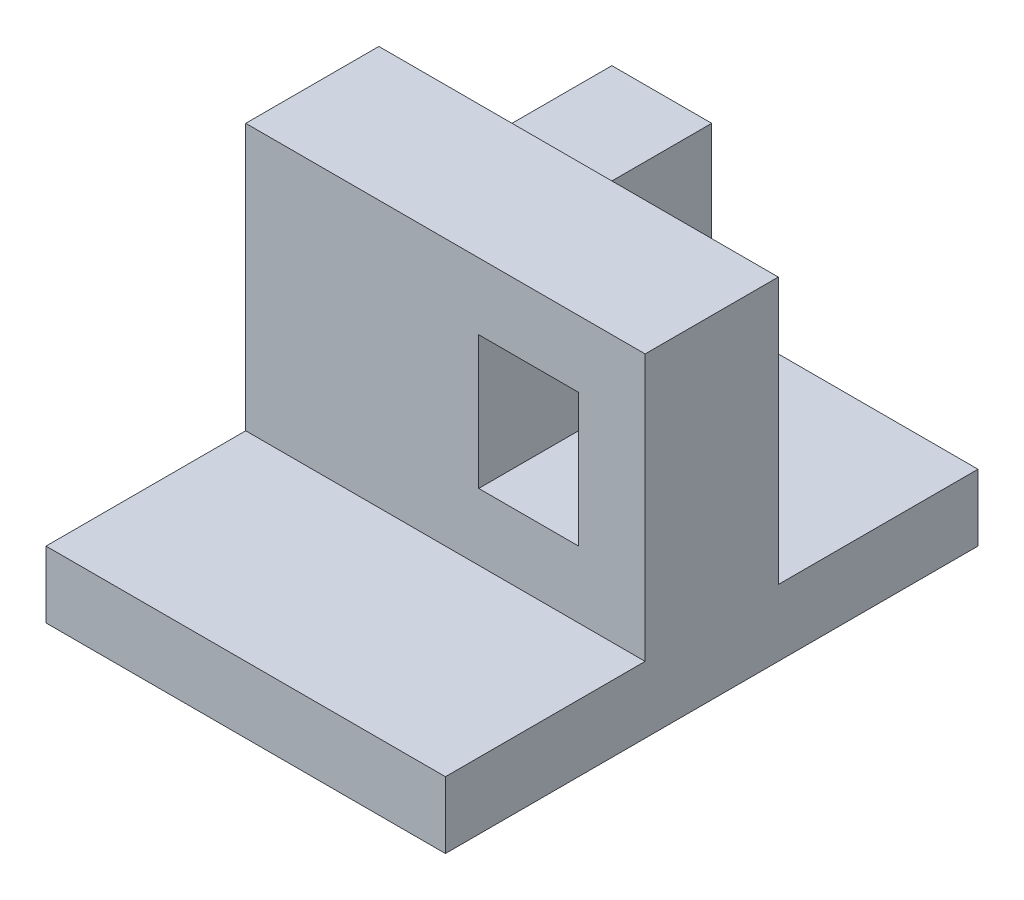
ISO-10303-21;
HEADER;
FILE_DESCRIPTION(('STEP AP214'),'2;1');
FILE_NAME('part.step','',(''),(''),'','','');
FILE_SCHEMA(('AUTOMOTIVE_DESIGN { 1 0 10303 214 1 1 1 1 }'));
ENDSEC;
DATA;
#1=APPLICATION_CONTEXT('core data for automotive mechanical design processes');
#2=APPLICATION_PROTOCOL_DEFINITION('international standard','automotive_design',2000,#1);
#3=PRODUCT_CONTEXT('',#1,'mechanical');
#4=PRODUCT('Part','Part','',(#3));
#5=PRODUCT_RELATED_PRODUCT_CATEGORY('part','',(#4));
#6=PRODUCT_DEFINITION_FORMATION('','',#4);
#7=PRODUCT_DEFINITION_CONTEXT('part definition',#1,'design');
#8=PRODUCT_DEFINITION('design','',#6,#7);
#9=PRODUCT_DEFINITION_SHAPE('','',#8);
#10=(LENGTH_UNIT() NAMED_UNIT(*) SI_UNIT(.MILLI.,.METRE.));
#11=(NAMED_UNIT(*) PLANE_ANGLE_UNIT() SI_UNIT($,.RADIAN.));
#12=(NAMED_UNIT(*) SI_UNIT($,.STERADIAN.) SOLID_ANGLE_UNIT());
#13=UNCERTAINTY_MEASURE_WITH_UNIT(LENGTH_MEASURE(1.E-05),#10,'distance_accuracy_value','');
#14=(GEOMETRIC_REPRESENTATION_CONTEXT(3) GLOBAL_UNCERTAINTY_ASSIGNED_CONTEXT((#13)) GLOBAL_UNIT_ASSIGNED_CONTEXT((#10,
#11,#12)) REPRESENTATION_CONTEXT('',''));
#15=CARTESIAN_POINT('',(0.,0.,0.));
#16=DIRECTION('',(0.,0.,1.));
#17=DIRECTION('',(1.,0.,0.));
#18=AXIS2_PLACEMENT_3D('',#15,#16,#17);
#19=CARTESIAN_POINT('',(0.,10.,-50.));
#20=DIRECTION('',(0.,-1.,0.));
#21=DIRECTION('',(0.,0.,-1.));
#22=AXIS2_PLACEMENT_3D('',#19,#20,#21);
#23=PLANE('',#22);
#24=DIRECTION('',(1.,0.,0.));
#25=VECTOR('',#24,1.);
#26=CARTESIAN_POINT('',(0.,10.,0.));
#27=LINE('',#26,#25);
#28=CARTESIAN_POINT('',(-60.,10.,0.));
#29=VERTEX_POINT('',#28);
#30=CARTESIAN_POINT('',(0.,10.,0.));
#31=VERTEX_POINT('',#30);
#32=EDGE_CURVE('E177',#29,#31,#27,.T.);
#33=ORIENTED_EDGE('',*,*,#32,.F.);
#34=DIRECTION('',(0.,0.,1.));
#35=VECTOR('',#34,1.);
#36=CARTESIAN_POINT('',(-60.,10.,-50.));
#37=LINE('',#36,#35);
#38=CARTESIAN_POINT('',(-60.,10.,30.));
#39=VERTEX_POINT('',#38);
#40=EDGE_CURVE('E268',#29,#39,#37,.T.);
#41=ORIENTED_EDGE('',*,*,#40,.T.);
#42=DIRECTION('',(1.,0.,0.));
#43=VECTOR('',#42,1.);
#44=CARTESIAN_POINT('',(0.,10.,30.));
#45=LINE('',#44,#43);
#46=CARTESIAN_POINT('',(0.,10.,30.));
#47=VERTEX_POINT('',#46);
#48=EDGE_CURVE('E252',#39,#47,#45,.T.);
#49=ORIENTED_EDGE('',*,*,#48,.T.);
#50=DIRECTION('',(0.,0.,1.));
#51=VECTOR('',#50,1.);
#52=CARTESIAN_POINT('',(0.,10.,-50.));
#53=LINE('',#52,#51);
#54=EDGE_CURVE('E271',#31,#47,#53,.T.);
#55=ORIENTED_EDGE('',*,*,#54,.F.);
#56=EDGE_LOOP('',(#33,#41,#49,#55));
#57=FACE_BOUND('',#56,.T.);
#58=ADVANCED_FACE('F33',(#57),#23,.F.);
#59=CARTESIAN_POINT('',(0.,0.,-50.));
#60=DIRECTION('',(0.,-1.,0.));
#61=DIRECTION('',(0.,0.,-1.));
#62=AXIS2_PLACEMENT_3D('',#59,#60,#61);
#63=PLANE('',#62);
#64=DIRECTION('',(0.,0.,1.));
#65=VECTOR('',#64,1.);
#66=CARTESIAN_POINT('',(0.,0.,-50.));
#67=LINE('',#66,#65);
#68=CARTESIAN_POINT('',(0.,0.,-50.));
#69=VERTEX_POINT('',#68);
#70=CARTESIAN_POINT('',(0.,0.,30.));
#71=VERTEX_POINT('',#70);
#72=EDGE_CURVE('E37',#69,#71,#67,.T.);
#73=ORIENTED_EDGE('',*,*,#72,.T.);
#74=DIRECTION('',(1.,0.,0.));
#75=VECTOR('',#74,1.);
#76=CARTESIAN_POINT('',(0.,0.,30.));
#77=LINE('',#76,#75);
#78=CARTESIAN_POINT('',(-60.,0.,30.));
#79=VERTEX_POINT('',#78);
#80=EDGE_CURVE('E235',#79,#71,#77,.T.);
#81=ORIENTED_EDGE('',*,*,#80,.F.);
#82=DIRECTION('',(0.,0.,1.));
#83=VECTOR('',#82,1.);
#84=CARTESIAN_POINT('',(-60.,0.,-50.));
#85=LINE('',#84,#83);
#86=CARTESIAN_POINT('',(-60.,0.,-50.));
#87=VERTEX_POINT('',#86);
#88=EDGE_CURVE('E11',#87,#79,#85,.T.);
#89=ORIENTED_EDGE('',*,*,#88,.F.);
#90=DIRECTION('',(1.,0.,0.));
#91=VECTOR('',#90,1.);
#92=CARTESIAN_POINT('',(0.,0.,-50.));
#93=LINE('',#92,#91);
#94=EDGE_CURVE('E258',#87,#69,#93,.T.);
#95=ORIENTED_EDGE('',*,*,#94,.T.);
#96=EDGE_LOOP('',(#73,#81,#89,#95));
#97=FACE_BOUND('',#96,.T.);
#98=ADVANCED_FACE('F35',(#97),#63,.T.);
#99=CARTESIAN_POINT('',(-60.,0.,-50.));
#100=DIRECTION('',(1.,0.,0.));
#101=DIRECTION('',(0.,0.,-1.));
#102=AXIS2_PLACEMENT_3D('',#99,#100,#101);
#103=PLANE('',#102);
#104=ORIENTED_EDGE('',*,*,#88,.T.);
#105=DIRECTION('',(0.,1.,0.));
#106=VECTOR('',#105,1.);
#107=CARTESIAN_POINT('',(-60.,0.,30.));
#108=LINE('',#107,#106);
#109=EDGE_CURVE('E255',#79,#39,#108,.T.);
#110=ORIENTED_EDGE('',*,*,#109,.T.);
#111=ORIENTED_EDGE('',*,*,#40,.F.);
#112=DIRECTION('',(0.,1.,0.));
#113=VECTOR('',#112,1.);
#114=CARTESIAN_POINT('',(-60.,0.,0.));
#115=LINE('',#114,#113);
#116=CARTESIAN_POINT('',(-60.,50.,0.));
#117=VERTEX_POINT('',#116);
#118=EDGE_CURVE('E219',#29,#117,#115,.T.);
#119=ORIENTED_EDGE('',*,*,#118,.T.);
#120=DIRECTION('',(0.,0.,1.));
#121=VECTOR('',#120,1.);
#122=CARTESIAN_POINT('',(-60.,50.,-20.));
#123=LINE('',#122,#121);
#124=CARTESIAN_POINT('',(-60.,50.,-20.));
#125=VERTEX_POINT('',#124);
#126=EDGE_CURVE('E243',#125,#117,#123,.T.);
#127=ORIENTED_EDGE('',*,*,#126,.F.);
#128=DIRECTION('',(0.,1.,0.));
#129=VECTOR('',#128,1.);
#130=CARTESIAN_POINT('',(-60.,0.,-20.));
#131=LINE('',#130,#129);
#132=CARTESIAN_POINT('',(-60.,10.,-20.));
#133=VERTEX_POINT('',#132);
#134=EDGE_CURVE('E196',#133,#125,#131,.T.);
#135=ORIENTED_EDGE('',*,*,#134,.F.);
#136=CARTESIAN_POINT('',(-60.,10.,-50.));
#137=VERTEX_POINT('',#136);
#138=EDGE_CURVE('E42',#137,#133,#37,.T.);
#139=ORIENTED_EDGE('',*,*,#138,.F.);
#140=DIRECTION('',(0.,1.,0.));
#141=VECTOR('',#140,1.);
#142=CARTESIAN_POINT('',(-60.,0.,-50.));
#143=LINE('',#142,#141);
#144=EDGE_CURVE('E265',#87,#137,#143,.T.);
#145=ORIENTED_EDGE('',*,*,#144,.F.);
#146=EDGE_LOOP('',(#104,#110,#111,#119,#127,#135,#139,#145));
#147=FACE_BOUND('',#146,.T.);
#148=ADVANCED_FACE('F285',(#147),#103,.F.);
#149=ORIENTED_EDGE('',*,*,#138,.T.);
#150=DIRECTION('',(1.,0.,0.));
#151=VECTOR('',#150,1.);
#152=CARTESIAN_POINT('',(0.,10.,-20.));
#153=LINE('',#152,#151);
#154=CARTESIAN_POINT('',(0.,10.,-20.));
#155=VERTEX_POINT('',#154);
#156=EDGE_CURVE('E191',#133,#155,#153,.T.);
#157=ORIENTED_EDGE('',*,*,#156,.T.);
#158=CARTESIAN_POINT('',(0.,10.,-50.));
#159=VERTEX_POINT('',#158);
#160=EDGE_CURVE('E269',#159,#155,#53,.T.);
#161=ORIENTED_EDGE('',*,*,#160,.F.);
#162=DIRECTION('',(1.,0.,0.));
#163=VECTOR('',#162,1.);
#164=CARTESIAN_POINT('',(0.,10.,-50.));
#165=LINE('',#164,#163);
#166=EDGE_CURVE('E263',#137,#159,#165,.T.);
#167=ORIENTED_EDGE('',*,*,#166,.F.);
#168=EDGE_LOOP('',(#149,#157,#161,#167));
#169=FACE_BOUND('',#168,.T.);
#170=ADVANCED_FACE('F291',(#169),#23,.F.);
#171=CARTESIAN_POINT('',(0.,0.,-50.));
#172=DIRECTION('',(1.,0.,0.));
#173=DIRECTION('',(0.,0.,-1.));
#174=AXIS2_PLACEMENT_3D('',#171,#172,#173);
#175=PLANE('',#174);
#176=ORIENTED_EDGE('',*,*,#160,.T.);
#177=DIRECTION('',(0.,1.,0.));
#178=VECTOR('',#177,1.);
#179=CARTESIAN_POINT('',(0.,0.,-20.));
#180=LINE('',#179,#178);
#181=CARTESIAN_POINT('',(0.,50.,-20.));
#182=VERTEX_POINT('',#181);
#183=EDGE_CURVE('E50',#155,#182,#180,.T.);
#184=ORIENTED_EDGE('',*,*,#183,.T.);
#185=DIRECTION('',(0.,0.,1.));
#186=VECTOR('',#185,1.);
#187=CARTESIAN_POINT('',(0.,50.,-20.));
#188=LINE('',#187,#186);
#189=CARTESIAN_POINT('',(0.,50.,0.));
#190=VERTEX_POINT('',#189);
#191=EDGE_CURVE('E210',#182,#190,#188,.T.);
#192=ORIENTED_EDGE('',*,*,#191,.T.);
#193=DIRECTION('',(0.,1.,0.));
#194=VECTOR('',#193,1.);
#195=CARTESIAN_POINT('',(0.,0.,0.));
#196=LINE('',#195,#194);
#197=EDGE_CURVE('E213',#31,#190,#196,.T.);
#198=ORIENTED_EDGE('',*,*,#197,.F.);
#199=ORIENTED_EDGE('',*,*,#54,.T.);
#200=DIRECTION('',(0.,1.,0.));
#201=VECTOR('',#200,1.);
#202=CARTESIAN_POINT('',(0.,0.,30.));
#203=LINE('',#202,#201);
#204=EDGE_CURVE('E249',#71,#47,#203,.T.);
#205=ORIENTED_EDGE('',*,*,#204,.F.);
#206=ORIENTED_EDGE('',*,*,#72,.F.);
#207=DIRECTION('',(0.,1.,0.));
#208=VECTOR('',#207,1.);
#209=CARTESIAN_POINT('',(0.,0.,-50.));
#210=LINE('',#209,#208);
#211=EDGE_CURVE('E260',#69,#159,#210,.T.);
#212=ORIENTED_EDGE('',*,*,#211,.T.);
#213=EDGE_LOOP('',(#176,#184,#192,#198,#199,#205,#206,#212));
#214=FACE_BOUND('',#213,.T.);
#215=ADVANCED_FACE('F279',(#214),#175,.T.);
#216=CARTESIAN_POINT('',(0.,0.,-50.));
#217=DIRECTION('',(0.,0.,1.));
#218=DIRECTION('',(1.,0.,0.));
#219=AXIS2_PLACEMENT_3D('',#216,#217,#218);
#220=PLANE('',#219);
#221=ORIENTED_EDGE('',*,*,#94,.F.);
#222=ORIENTED_EDGE('',*,*,#144,.T.);
#223=ORIENTED_EDGE('',*,*,#166,.T.);
#224=ORIENTED_EDGE('',*,*,#211,.F.);
#225=EDGE_LOOP('',(#221,#222,#223,#224));
#226=FACE_BOUND('',#225,.T.);
#227=ADVANCED_FACE('F289',(#226),#220,.F.);
#228=CARTESIAN_POINT('',(0.,0.,30.));
#229=DIRECTION('',(0.,0.,1.));
#230=DIRECTION('',(1.,0.,0.));
#231=AXIS2_PLACEMENT_3D('',#228,#229,#230);
#232=PLANE('',#231);
#233=ORIENTED_EDGE('',*,*,#80,.T.);
#234=ORIENTED_EDGE('',*,*,#204,.T.);
#235=ORIENTED_EDGE('',*,*,#48,.F.);
#236=ORIENTED_EDGE('',*,*,#109,.F.);
#237=EDGE_LOOP('',(#233,#234,#235,#236));
#238=FACE_BOUND('',#237,.T.);
#239=ADVANCED_FACE('F282',(#238),#232,.T.);
#240=CARTESIAN_POINT('',(0.,40.,-20.));
#241=DIRECTION('',(0.,-1.,0.));
#242=DIRECTION('',(0.,0.,-1.));
#243=AXIS2_PLACEMENT_3D('',#240,#241,#242);
#244=PLANE('',#243);
#245=DIRECTION('',(1.,0.,0.));
#246=VECTOR('',#245,1.);
#247=CARTESIAN_POINT('',(0.,40.,0.));
#248=LINE('',#247,#246);
#249=CARTESIAN_POINT('',(-25.,40.,0.));
#250=VERTEX_POINT('',#249);
#251=CARTESIAN_POINT('',(-10.,40.,0.));
#252=VERTEX_POINT('',#251);
#253=EDGE_CURVE('E222',#250,#252,#248,.T.);
#254=ORIENTED_EDGE('',*,*,#253,.F.);
#255=DIRECTION('',(0.,0.,1.));
#256=VECTOR('',#255,1.);
#257=CARTESIAN_POINT('',(-25.,40.,-20.));
#258=LINE('',#257,#256);
#259=CARTESIAN_POINT('',(-25.,40.,-20.));
#260=VERTEX_POINT('',#259);
#261=EDGE_CURVE('E233',#260,#250,#258,.T.);
#262=ORIENTED_EDGE('',*,*,#261,.F.);
#263=DIRECTION('',(1.,0.,0.));
#264=VECTOR('',#263,1.);
#265=CARTESIAN_POINT('',(0.,40.,-20.));
#266=LINE('',#265,#264);
#267=CARTESIAN_POINT('',(-10.,40.,-20.));
#268=VERTEX_POINT('',#267);
#269=EDGE_CURVE('E199',#260,#268,#266,.T.);
#270=ORIENTED_EDGE('',*,*,#269,.T.);
#271=DIRECTION('',(0.,0.,1.));
#272=VECTOR('',#271,1.);
#273=CARTESIAN_POINT('',(-10.,40.,-20.));
#274=LINE('',#273,#272);
#275=EDGE_CURVE('E241',#268,#252,#274,.T.);
#276=ORIENTED_EDGE('',*,*,#275,.T.);
#277=EDGE_LOOP('',(#254,#262,#270,#276));
#278=FACE_BOUND('',#277,.T.);
#279=ADVANCED_FACE('F321',(#278),#244,.T.);
#280=CARTESIAN_POINT('',(-25.,0.,-20.));
#281=DIRECTION('',(-1.,0.,0.));
#282=DIRECTION('',(0.,0.,1.));
#283=AXIS2_PLACEMENT_3D('',#280,#281,#282);
#284=PLANE('',#283);
#285=DIRECTION('',(0.,-1.,0.));
#286=VECTOR('',#285,1.);
#287=CARTESIAN_POINT('',(-25.,0.,0.));
#288=LINE('',#287,#286);
#289=CARTESIAN_POINT('',(-25.,20.,0.));
#290=VERTEX_POINT('',#289);
#291=EDGE_CURVE('E184',#250,#290,#288,.T.);
#292=ORIENTED_EDGE('',*,*,#291,.T.);
#293=DIRECTION('',(0.,0.,1.));
#294=VECTOR('',#293,1.);
#295=CARTESIAN_POINT('',(-25.,20.,-20.));
#296=LINE('',#295,#294);
#297=CARTESIAN_POINT('',(-25.,20.,-20.));
#298=VERTEX_POINT('',#297);
#299=EDGE_CURVE('E236',#298,#290,#296,.T.);
#300=ORIENTED_EDGE('',*,*,#299,.F.);
#301=DIRECTION('',(0.,-1.,0.));
#302=VECTOR('',#301,1.);
#303=CARTESIAN_POINT('',(-25.,0.,-20.));
#304=LINE('',#303,#302);
#305=EDGE_CURVE('E207',#260,#298,#304,.T.);
#306=ORIENTED_EDGE('',*,*,#305,.F.);
#307=ORIENTED_EDGE('',*,*,#261,.T.);
#308=EDGE_LOOP('',(#292,#300,#306,#307));
#309=FACE_BOUND('',#308,.T.);
#310=ADVANCED_FACE('F328',(#309),#284,.F.);
#311=CARTESIAN_POINT('',(0.,20.,-20.));
#312=DIRECTION('',(0.,-1.,0.));
#313=DIRECTION('',(0.,0.,-1.));
#314=AXIS2_PLACEMENT_3D('',#311,#312,#313);
#315=PLANE('',#314);
#316=DIRECTION('',(1.,0.,0.));
#317=VECTOR('',#316,1.);
#318=CARTESIAN_POINT('',(0.,20.,0.));
#319=LINE('',#318,#317);
#320=CARTESIAN_POINT('',(-10.,20.,0.));
#321=VERTEX_POINT('',#320);
#322=EDGE_CURVE('E228',#290,#321,#319,.T.);
#323=ORIENTED_EDGE('',*,*,#322,.T.);
#324=DIRECTION('',(0.,0.,1.));
#325=VECTOR('',#324,1.);
#326=CARTESIAN_POINT('',(-10.,20.,-20.));
#327=LINE('',#326,#325);
#328=CARTESIAN_POINT('',(-10.,20.,-20.));
#329=VERTEX_POINT('',#328);
#330=EDGE_CURVE('E239',#329,#321,#327,.T.);
#331=ORIENTED_EDGE('',*,*,#330,.F.);
#332=DIRECTION('',(1.,0.,0.));
#333=VECTOR('',#332,1.);
#334=CARTESIAN_POINT('',(0.,20.,-20.));
#335=LINE('',#334,#333);
#336=EDGE_CURVE('E205',#298,#329,#335,.T.);
#337=ORIENTED_EDGE('',*,*,#336,.F.);
#338=ORIENTED_EDGE('',*,*,#299,.T.);
#339=EDGE_LOOP('',(#323,#331,#337,#338));
#340=FACE_BOUND('',#339,.T.);
#341=ADVANCED_FACE('F325',(#340),#315,.F.);
#342=CARTESIAN_POINT('',(0.,50.,-20.));
#343=DIRECTION('',(0.,-1.,0.));
#344=DIRECTION('',(1.,0.,0.));
#345=AXIS2_PLACEMENT_3D('',#342,#343,#344);
#346=PLANE('',#345);
#347=DIRECTION('',(1.,0.,0.));
#348=VECTOR('',#347,1.);
#349=CARTESIAN_POINT('',(0.,50.,0.));
#350=LINE('',#349,#348);
#351=EDGE_CURVE('E216',#117,#190,#350,.T.);
#352=ORIENTED_EDGE('',*,*,#351,.T.);
#353=ORIENTED_EDGE('',*,*,#191,.F.);
#354=DIRECTION('',(1.,0.,0.));
#355=VECTOR('',#354,1.);
#356=CARTESIAN_POINT('',(0.,50.,-20.));
#357=LINE('',#356,#355);
#358=EDGE_CURVE('E194',#125,#182,#357,.T.);
#359=ORIENTED_EDGE('',*,*,#358,.F.);
#360=ORIENTED_EDGE('',*,*,#126,.T.);
#361=EDGE_LOOP('',(#352,#353,#359,#360));
#362=FACE_BOUND('',#361,.T.);
#363=ADVANCED_FACE('F297',(#362),#346,.F.);
#364=CARTESIAN_POINT('',(-9.99999999999999,0.,-20.));
#365=DIRECTION('',(-1.,0.,0.));
#366=DIRECTION('',(0.,-1.,0.));
#367=AXIS2_PLACEMENT_3D('',#364,#365,#366);
#368=PLANE('',#367);
#369=DIRECTION('',(0.,-1.,0.));
#370=VECTOR('',#369,1.);
#371=CARTESIAN_POINT('',(-9.99999999999999,0.,0.));
#372=LINE('',#371,#370);
#373=EDGE_CURVE('E225',#252,#321,#372,.T.);
#374=ORIENTED_EDGE('',*,*,#373,.F.);
#375=ORIENTED_EDGE('',*,*,#275,.F.);
#376=DIRECTION('',(0.,-1.,0.));
#377=VECTOR('',#376,1.);
#378=CARTESIAN_POINT('',(-9.99999999999999,0.,-20.));
#379=LINE('',#378,#377);
#380=EDGE_CURVE('E202',#268,#329,#379,.T.);
#381=ORIENTED_EDGE('',*,*,#380,.T.);
#382=ORIENTED_EDGE('',*,*,#330,.T.);
#383=EDGE_LOOP('',(#374,#375,#381,#382));
#384=FACE_BOUND('',#383,.T.);
#385=ADVANCED_FACE('F324',(#384),#368,.T.);
#386=CARTESIAN_POINT('',(0.,0.,-20.));
#387=DIRECTION('',(0.,0.,1.));
#388=DIRECTION('',(1.,0.,0.));
#389=AXIS2_PLACEMENT_3D('',#386,#387,#388);
#390=PLANE('',#389);
#391=DIRECTION('',(0.,-1.,0.));
#392=VECTOR('',#391,1.);
#393=CARTESIAN_POINT('',(-50.,0.,-20.));
#394=LINE('',#393,#392);
#395=CARTESIAN_POINT('',(-50.,40.,-20.));
#396=VERTEX_POINT('',#395);
#397=CARTESIAN_POINT('',(-50.,20.,-20.));
#398=VERTEX_POINT('',#397);
#399=EDGE_CURVE('E153',#396,#398,#394,.T.);
#400=ORIENTED_EDGE('',*,*,#399,.T.);
#401=DIRECTION('',(-1.,0.,0.));
#402=VECTOR('',#401,1.);
#403=CARTESIAN_POINT('',(0.,20.,-20.));
#404=LINE('',#403,#402);
#405=CARTESIAN_POINT('',(-35.,20.,-20.));
#406=VERTEX_POINT('',#405);
#407=EDGE_CURVE('E188',#406,#398,#404,.T.);
#408=ORIENTED_EDGE('',*,*,#407,.F.);
#409=DIRECTION('',(0.,-1.,0.));
#410=VECTOR('',#409,1.);
#411=CARTESIAN_POINT('',(-35.,0.,-20.));
#412=LINE('',#411,#410);
#413=CARTESIAN_POINT('',(-35.,40.,-20.));
#414=VERTEX_POINT('',#413);
#415=EDGE_CURVE('E186',#414,#406,#412,.T.);
#416=ORIENTED_EDGE('',*,*,#415,.F.);
#417=DIRECTION('',(-1.,0.,0.));
#418=VECTOR('',#417,1.);
#419=CARTESIAN_POINT('',(0.,40.0000000000001,-20.));
#420=LINE('',#419,#418);
#421=EDGE_CURVE('E183',#414,#396,#420,.T.);
#422=ORIENTED_EDGE('',*,*,#421,.T.);
#423=EDGE_LOOP('',(#400,#408,#416,#422));
#424=FACE_BOUND('',#423,.T.);
#425=ORIENTED_EDGE('',*,*,#156,.F.);
#426=ORIENTED_EDGE('',*,*,#134,.T.);
#427=ORIENTED_EDGE('',*,*,#358,.T.);
#428=ORIENTED_EDGE('',*,*,#183,.F.);
#429=EDGE_LOOP('',(#425,#426,#427,#428));
#430=FACE_BOUND('',#429,.T.);
#431=ORIENTED_EDGE('',*,*,#269,.F.);
#432=ORIENTED_EDGE('',*,*,#305,.T.);
#433=ORIENTED_EDGE('',*,*,#336,.T.);
#434=ORIENTED_EDGE('',*,*,#380,.F.);
#435=EDGE_LOOP('',(#431,#432,#433,#434));
#436=FACE_BOUND('',#435,.T.);
#437=ADVANCED_FACE('F292',(#424,#430,#436),#390,.F.);
#438=CARTESIAN_POINT('',(0.,0.,0.));
#439=DIRECTION('',(0.,0.,1.));
#440=DIRECTION('',(1.,0.,0.));
#441=AXIS2_PLACEMENT_3D('',#438,#439,#440);
#442=PLANE('',#441);
#443=ORIENTED_EDGE('',*,*,#32,.T.);
#444=ORIENTED_EDGE('',*,*,#197,.T.);
#445=ORIENTED_EDGE('',*,*,#351,.F.);
#446=ORIENTED_EDGE('',*,*,#118,.F.);
#447=EDGE_LOOP('',(#443,#444,#445,#446));
#448=FACE_BOUND('',#447,.T.);
#449=ORIENTED_EDGE('',*,*,#253,.T.);
#450=ORIENTED_EDGE('',*,*,#373,.T.);
#451=ORIENTED_EDGE('',*,*,#322,.F.);
#452=ORIENTED_EDGE('',*,*,#291,.F.);
#453=EDGE_LOOP('',(#449,#450,#451,#452));
#454=FACE_BOUND('',#453,.T.);
#455=ADVANCED_FACE('F300',(#448,#454),#442,.T.);
#456=CARTESIAN_POINT('',(0.,40.0000000000001,-45.));
#457=DIRECTION('',(0.,1.,0.));
#458=DIRECTION('',(-1.,0.,0.));
#459=AXIS2_PLACEMENT_3D('',#456,#457,#458);
#460=PLANE('',#459);
#461=ORIENTED_EDGE('',*,*,#421,.F.);
#462=DIRECTION('',(0.,0.,1.));
#463=VECTOR('',#462,1.);
#464=CARTESIAN_POINT('',(-35.,40.,-45.));
#465=LINE('',#464,#463);
#466=CARTESIAN_POINT('',(-35.,40.,-45.));
#467=VERTEX_POINT('',#466);
#468=EDGE_CURVE('E170',#467,#414,#465,.T.);
#469=ORIENTED_EDGE('',*,*,#468,.F.);
#470=DIRECTION('',(-1.,0.,0.));
#471=VECTOR('',#470,1.);
#472=CARTESIAN_POINT('',(0.,40.0000000000001,-45.));
#473=LINE('',#472,#471);
#474=CARTESIAN_POINT('',(-50.,40.,-45.));
#475=VERTEX_POINT('',#474);
#476=EDGE_CURVE('E163',#467,#475,#473,.T.);
#477=ORIENTED_EDGE('',*,*,#476,.T.);
#478=DIRECTION('',(0.,0.,1.));
#479=VECTOR('',#478,1.);
#480=CARTESIAN_POINT('',(-50.,40.,-45.));
#481=LINE('',#480,#479);
#482=EDGE_CURVE('E148',#475,#396,#481,.T.);
#483=ORIENTED_EDGE('',*,*,#482,.T.);
#484=EDGE_LOOP('',(#461,#469,#477,#483));
#485=FACE_BOUND('',#484,.T.);
#486=ADVANCED_FACE('F168',(#485),#460,.T.);
#487=CARTESIAN_POINT('',(-35.,0.,-45.));
#488=DIRECTION('',(-1.,0.,0.));
#489=DIRECTION('',(0.,0.,1.));
#490=AXIS2_PLACEMENT_3D('',#487,#488,#489);
#491=PLANE('',#490);
#492=ORIENTED_EDGE('',*,*,#468,.T.);
#493=ORIENTED_EDGE('',*,*,#415,.T.);
#494=DIRECTION('',(0.,0.,1.));
#495=VECTOR('',#494,1.);
#496=CARTESIAN_POINT('',(-35.,20.,-45.));
#497=LINE('',#496,#495);
#498=CARTESIAN_POINT('',(-35.,20.,-45.));
#499=VERTEX_POINT('',#498);
#500=EDGE_CURVE('E178',#499,#406,#497,.T.);
#501=ORIENTED_EDGE('',*,*,#500,.F.);
#502=DIRECTION('',(0.,-1.,0.));
#503=VECTOR('',#502,1.);
#504=CARTESIAN_POINT('',(-35.,0.,-45.));
#505=LINE('',#504,#503);
#506=EDGE_CURVE('E158',#467,#499,#505,.T.);
#507=ORIENTED_EDGE('',*,*,#506,.F.);
#508=EDGE_LOOP('',(#492,#493,#501,#507));
#509=FACE_BOUND('',#508,.T.);
#510=ADVANCED_FACE('F346',(#509),#491,.F.);
#511=CARTESIAN_POINT('',(0.,20.,-45.));
#512=DIRECTION('',(0.,1.,0.));
#513=DIRECTION('',(0.,0.,1.));
#514=AXIS2_PLACEMENT_3D('',#511,#512,#513);
#515=PLANE('',#514);
#516=ORIENTED_EDGE('',*,*,#500,.T.);
#517=ORIENTED_EDGE('',*,*,#407,.T.);
#518=DIRECTION('',(0.,0.,1.));
#519=VECTOR('',#518,1.);
#520=CARTESIAN_POINT('',(-50.,20.,-45.));
#521=LINE('',#520,#519);
#522=CARTESIAN_POINT('',(-50.,20.,-45.));
#523=VERTEX_POINT('',#522);
#524=EDGE_CURVE('E157',#523,#398,#521,.T.);
#525=ORIENTED_EDGE('',*,*,#524,.F.);
#526=DIRECTION('',(-1.,0.,0.));
#527=VECTOR('',#526,1.);
#528=CARTESIAN_POINT('',(0.,20.,-45.));
#529=LINE('',#528,#527);
#530=EDGE_CURVE('E165',#499,#523,#529,.T.);
#531=ORIENTED_EDGE('',*,*,#530,.F.);
#532=EDGE_LOOP('',(#516,#517,#525,#531));
#533=FACE_BOUND('',#532,.T.);
#534=ADVANCED_FACE('F349',(#533),#515,.F.);
#535=CARTESIAN_POINT('',(-50.,0.,-45.));
#536=DIRECTION('',(-1.,0.,0.));
#537=DIRECTION('',(0.,0.,1.));
#538=AXIS2_PLACEMENT_3D('',#535,#536,#537);
#539=PLANE('',#538);
#540=ORIENTED_EDGE('',*,*,#399,.F.);
#541=ORIENTED_EDGE('',*,*,#482,.F.);
#542=DIRECTION('',(0.,-1.,0.));
#543=VECTOR('',#542,1.);
#544=CARTESIAN_POINT('',(-50.,0.,-45.));
#545=LINE('',#544,#543);
#546=EDGE_CURVE('E151',#475,#523,#545,.T.);
#547=ORIENTED_EDGE('',*,*,#546,.T.);
#548=ORIENTED_EDGE('',*,*,#524,.T.);
#549=EDGE_LOOP('',(#540,#541,#547,#548));
#550=FACE_BOUND('',#549,.T.);
#551=ADVANCED_FACE('F150',(#550),#539,.T.);
#552=CARTESIAN_POINT('',(0.,0.,-45.));
#553=DIRECTION('',(0.,0.,1.));
#554=DIRECTION('',(1.,0.,0.));
#555=AXIS2_PLACEMENT_3D('',#552,#553,#554);
#556=PLANE('',#555);
#557=ORIENTED_EDGE('',*,*,#476,.F.);
#558=ORIENTED_EDGE('',*,*,#506,.T.);
#559=ORIENTED_EDGE('',*,*,#530,.T.);
#560=ORIENTED_EDGE('',*,*,#546,.F.);
#561=EDGE_LOOP('',(#557,#558,#559,#560));
#562=FACE_BOUND('',#561,.T.);
#563=ADVANCED_FACE('F162',(#562),#556,.F.);
#564=CLOSED_SHELL('',(#58,#98,#148,#170,#215,#227,#239,#279,#310,#341,#363,#385,#437,#455,#486,
#510,#534,#551,#563));
#565=MANIFOLD_SOLID_BREP('B2',#564);
#566=ADVANCED_BREP_SHAPE_REPRESENTATION('',(#18,#565),#14);
#567=SHAPE_DEFINITION_REPRESENTATION(#9,#566);
ENDSEC;
END-ISO-10303-21;
